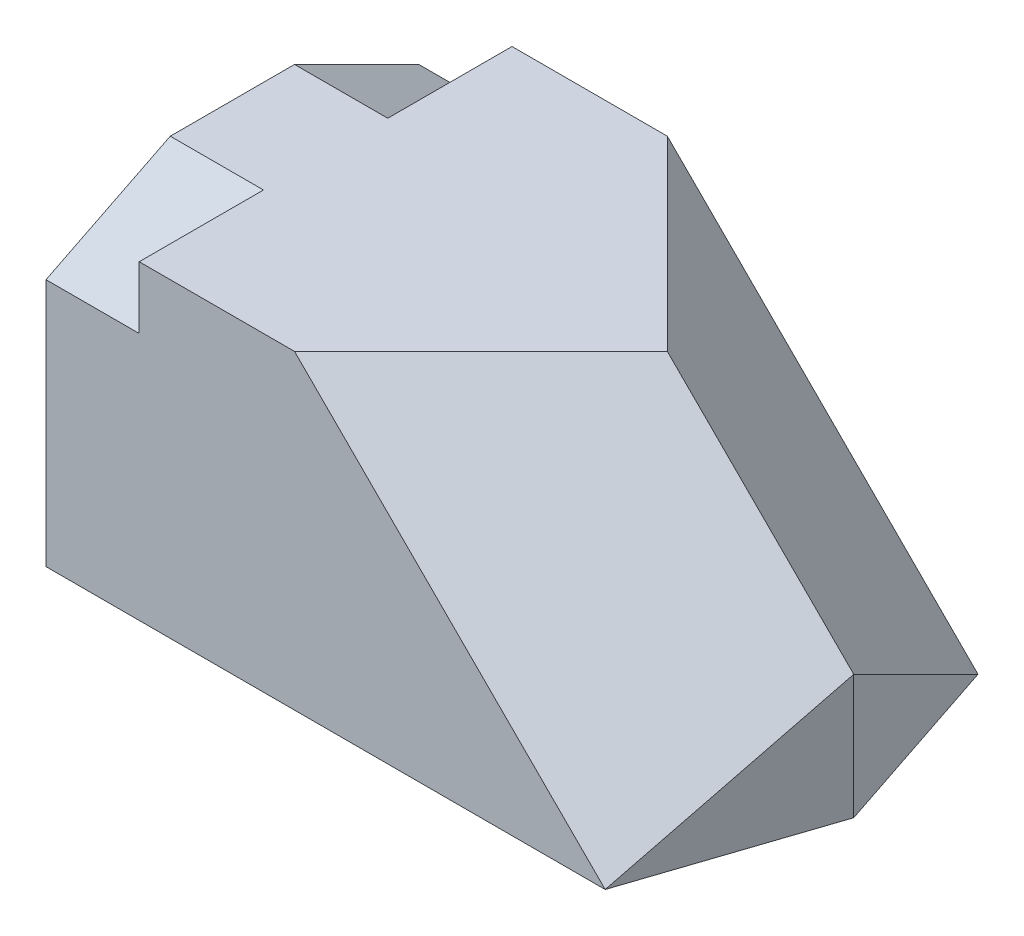
ISO-10303-21;
HEADER;
FILE_DESCRIPTION(('STEP AP214'),'2;1');
FILE_NAME('part.step','',(''),(''),'','','');
FILE_SCHEMA(('AUTOMOTIVE_DESIGN { 1 0 10303 214 1 1 1 1 }'));
ENDSEC;
DATA;
#1=APPLICATION_CONTEXT('core data for automotive mechanical design processes');
#2=APPLICATION_PROTOCOL_DEFINITION('international standard','automotive_design',2000,#1);
#3=PRODUCT_CONTEXT('',#1,'mechanical');
#4=PRODUCT('Part','Part','',(#3));
#5=PRODUCT_RELATED_PRODUCT_CATEGORY('part','',(#4));
#6=PRODUCT_DEFINITION_FORMATION('','',#4);
#7=PRODUCT_DEFINITION_CONTEXT('part definition',#1,'design');
#8=PRODUCT_DEFINITION('design','',#6,#7);
#9=PRODUCT_DEFINITION_SHAPE('','',#8);
#10=(LENGTH_UNIT() NAMED_UNIT(*) SI_UNIT(.MILLI.,.METRE.));
#11=(NAMED_UNIT(*) PLANE_ANGLE_UNIT() SI_UNIT($,.RADIAN.));
#12=(NAMED_UNIT(*) SI_UNIT($,.STERADIAN.) SOLID_ANGLE_UNIT());
#13=UNCERTAINTY_MEASURE_WITH_UNIT(LENGTH_MEASURE(1.E-05),#10,'distance_accuracy_value','');
#14=(GEOMETRIC_REPRESENTATION_CONTEXT(3) GLOBAL_UNCERTAINTY_ASSIGNED_CONTEXT((#13)) GLOBAL_UNIT_ASSIGNED_CONTEXT((#10,
#11,#12)) REPRESENTATION_CONTEXT('',''));
#15=CARTESIAN_POINT('',(0.,0.,0.));
#16=DIRECTION('',(0.,0.,1.));
#17=DIRECTION('',(1.,0.,0.));
#18=AXIS2_PLACEMENT_3D('',#15,#16,#17);
#19=CARTESIAN_POINT('',(0.,0.,-30.));
#20=DIRECTION('',(0.,0.,1.));
#21=DIRECTION('',(1.,0.,0.));
#22=AXIS2_PLACEMENT_3D('',#19,#20,#21);
#23=PLANE('',#22);
#24=DIRECTION('',(-0.707106781186548,0.707106781186548,0.));
#25=VECTOR('',#24,1.);
#26=CARTESIAN_POINT('',(95.,-5.00000000000001,-30.));
#27=LINE('',#26,#25);
#28=CARTESIAN_POINT('',(90.,0.,-30.));
#29=VERTEX_POINT('',#28);
#30=CARTESIAN_POINT('',(40.,50.,-30.));
#31=VERTEX_POINT('',#30);
#32=EDGE_CURVE('E115',#29,#31,#27,.T.);
#33=ORIENTED_EDGE('',*,*,#32,.F.);
#34=DIRECTION('',(1.,0.,0.));
#35=VECTOR('',#34,1.);
#36=CARTESIAN_POINT('',(0.,0.,-30.));
#37=LINE('',#36,#35);
#38=CARTESIAN_POINT('',(0.,0.,-30.));
#39=VERTEX_POINT('',#38);
#40=EDGE_CURVE('E135',#39,#29,#37,.T.);
#41=ORIENTED_EDGE('',*,*,#40,.F.);
#42=DIRECTION('',(0.,-1.,0.));
#43=VECTOR('',#42,1.);
#44=CARTESIAN_POINT('',(0.,50.,-30.));
#45=LINE('',#44,#43);
#46=CARTESIAN_POINT('',(0.,40.,-30.));
#47=VERTEX_POINT('',#46);
#48=EDGE_CURVE('E140',#47,#39,#45,.T.);
#49=ORIENTED_EDGE('',*,*,#48,.F.);
#50=DIRECTION('',(-1.,0.,0.));
#51=VECTOR('',#50,1.);
#52=CARTESIAN_POINT('',(15.,40.,-30.));
#53=LINE('',#52,#51);
#54=CARTESIAN_POINT('',(15.,40.,-30.));
#55=VERTEX_POINT('',#54);
#56=EDGE_CURVE('E185',#55,#47,#53,.T.);
#57=ORIENTED_EDGE('',*,*,#56,.F.);
#58=DIRECTION('',(0.,1.,0.));
#59=VECTOR('',#58,1.);
#60=CARTESIAN_POINT('',(15.,50.,-30.));
#61=LINE('',#60,#59);
#62=CARTESIAN_POINT('',(15.,50.,-30.));
#63=VERTEX_POINT('',#62);
#64=EDGE_CURVE('E133',#55,#63,#61,.T.);
#65=ORIENTED_EDGE('',*,*,#64,.T.);
#66=DIRECTION('',(-1.,0.,0.));
#67=VECTOR('',#66,1.);
#68=CARTESIAN_POINT('',(100.,50.,-30.));
#69=LINE('',#68,#67);
#70=EDGE_CURVE('E54',#31,#63,#69,.T.);
#71=ORIENTED_EDGE('',*,*,#70,.F.);
#72=EDGE_LOOP('',(#33,#41,#49,#57,#65,#71));
#73=FACE_BOUND('',#72,.T.);
#74=ADVANCED_FACE('F39',(#73),#23,.F.);
#75=CARTESIAN_POINT('',(100.,50.,30.));
#76=DIRECTION('',(0.,-1.,0.));
#77=DIRECTION('',(1.,0.,0.));
#78=AXIS2_PLACEMENT_3D('',#75,#76,#77);
#79=PLANE('',#78);
#80=DIRECTION('',(-0.707106781186547,0.,-0.707106781186547));
#81=VECTOR('',#80,1.);
#82=CARTESIAN_POINT('',(70.,50.,0.));
#83=LINE('',#82,#81);
#84=CARTESIAN_POINT('',(70.,50.,0.));
#85=VERTEX_POINT('',#84);
#86=EDGE_CURVE('E117',#85,#31,#83,.T.);
#87=ORIENTED_EDGE('',*,*,#86,.T.);
#88=ORIENTED_EDGE('',*,*,#70,.T.);
#89=DIRECTION('',(0.,0.,1.));
#90=VECTOR('',#89,1.);
#91=CARTESIAN_POINT('',(15.,50.,-10.));
#92=LINE('',#91,#90);
#93=CARTESIAN_POINT('',(15.,50.,-10.));
#94=VERTEX_POINT('',#93);
#95=EDGE_CURVE('E192',#63,#94,#92,.T.);
#96=ORIENTED_EDGE('',*,*,#95,.T.);
#97=DIRECTION('',(-1.,0.,0.));
#98=VECTOR('',#97,1.);
#99=CARTESIAN_POINT('',(15.,50.,-10.));
#100=LINE('',#99,#98);
#101=CARTESIAN_POINT('',(0.,50.,-10.));
#102=VERTEX_POINT('',#101);
#103=EDGE_CURVE('E184',#94,#102,#100,.T.);
#104=ORIENTED_EDGE('',*,*,#103,.T.);
#105=DIRECTION('',(0.,0.,-1.));
#106=VECTOR('',#105,1.);
#107=CARTESIAN_POINT('',(0.,50.,30.));
#108=LINE('',#107,#106);
#109=CARTESIAN_POINT('',(0.,50.,10.));
#110=VERTEX_POINT('',#109);
#111=EDGE_CURVE('E47',#110,#102,#108,.T.);
#112=ORIENTED_EDGE('',*,*,#111,.F.);
#113=DIRECTION('',(-1.,0.,0.));
#114=VECTOR('',#113,1.);
#115=CARTESIAN_POINT('',(15.,50.,10.));
#116=LINE('',#115,#114);
#117=CARTESIAN_POINT('',(15.,50.,10.));
#118=VERTEX_POINT('',#117);
#119=EDGE_CURVE('E159',#118,#110,#116,.T.);
#120=ORIENTED_EDGE('',*,*,#119,.F.);
#121=DIRECTION('',(0.,0.,-1.));
#122=VECTOR('',#121,1.);
#123=CARTESIAN_POINT('',(15.,50.,10.));
#124=LINE('',#123,#122);
#125=CARTESIAN_POINT('',(15.,50.,30.));
#126=VERTEX_POINT('',#125);
#127=EDGE_CURVE('E167',#126,#118,#124,.T.);
#128=ORIENTED_EDGE('',*,*,#127,.F.);
#129=DIRECTION('',(-1.,0.,0.));
#130=VECTOR('',#129,1.);
#131=CARTESIAN_POINT('',(100.,50.,30.));
#132=LINE('',#131,#130);
#133=CARTESIAN_POINT('',(40.,50.,30.));
#134=VERTEX_POINT('',#133);
#135=EDGE_CURVE('E144',#134,#126,#132,.T.);
#136=ORIENTED_EDGE('',*,*,#135,.F.);
#137=DIRECTION('',(-0.707106781186547,0.,0.707106781186547));
#138=VECTOR('',#137,1.);
#139=CARTESIAN_POINT('',(70.,50.,0.));
#140=LINE('',#139,#138);
#141=EDGE_CURVE('E128',#85,#134,#140,.T.);
#142=ORIENTED_EDGE('',*,*,#141,.F.);
#143=EDGE_LOOP('',(#87,#88,#96,#104,#112,#120,#128,#136,#142));
#144=FACE_BOUND('',#143,.T.);
#145=ADVANCED_FACE('F126',(#144),#79,.F.);
#146=CARTESIAN_POINT('',(100.,20.,0.));
#147=DIRECTION('',(0.948683298050514,0.,-0.316227766016838));
#148=DIRECTION('',(-0.316227766016838,0.,-0.948683298050514));
#149=AXIS2_PLACEMENT_3D('',#146,#147,#148);
#150=PLANE('',#149);
#151=DIRECTION('',(0.316227766016838,0.,0.948683298050514));
#152=VECTOR('',#151,1.);
#153=CARTESIAN_POINT('',(100.,0.,0.));
#154=LINE('',#153,#152);
#155=CARTESIAN_POINT('',(100.,0.,0.));
#156=VERTEX_POINT('',#155);
#157=EDGE_CURVE('E193',#29,#156,#154,.T.);
#158=ORIENTED_EDGE('',*,*,#157,.F.);
#159=DIRECTION('',(0.267261241912424,0.534522483824849,0.801783725737273));
#160=VECTOR('',#159,1.);
#161=CARTESIAN_POINT('',(100.,20.,0.));
#162=LINE('',#161,#160);
#163=CARTESIAN_POINT('',(100.,20.,0.));
#164=VERTEX_POINT('',#163);
#165=EDGE_CURVE('E120',#29,#164,#162,.T.);
#166=ORIENTED_EDGE('',*,*,#165,.T.);
#167=DIRECTION('',(0.,-1.,0.));
#168=VECTOR('',#167,1.);
#169=CARTESIAN_POINT('',(100.,20.,0.));
#170=LINE('',#169,#168);
#171=EDGE_CURVE('E168',#164,#156,#170,.T.);
#172=ORIENTED_EDGE('',*,*,#171,.T.);
#173=EDGE_LOOP('',(#158,#166,#172));
#174=FACE_BOUND('',#173,.T.);
#175=ADVANCED_FACE('F201',(#174),#150,.T.);
#176=CARTESIAN_POINT('',(0.,0.,30.));
#177=DIRECTION('',(0.,1.,0.));
#178=DIRECTION('',(0.,0.,1.));
#179=AXIS2_PLACEMENT_3D('',#176,#177,#178);
#180=PLANE('',#179);
#181=ORIENTED_EDGE('',*,*,#157,.T.);
#182=DIRECTION('',(0.316227766016838,0.,-0.948683298050514));
#183=VECTOR('',#182,1.);
#184=CARTESIAN_POINT('',(100.,0.,0.));
#185=LINE('',#184,#183);
#186=CARTESIAN_POINT('',(90.,0.,30.));
#187=VERTEX_POINT('',#186);
#188=EDGE_CURVE('E173',#187,#156,#185,.T.);
#189=ORIENTED_EDGE('',*,*,#188,.F.);
#190=DIRECTION('',(1.,0.,0.));
#191=VECTOR('',#190,1.);
#192=CARTESIAN_POINT('',(0.,0.,30.));
#193=LINE('',#192,#191);
#194=CARTESIAN_POINT('',(0.,0.,30.));
#195=VERTEX_POINT('',#194);
#196=EDGE_CURVE('E137',#195,#187,#193,.T.);
#197=ORIENTED_EDGE('',*,*,#196,.F.);
#198=DIRECTION('',(0.,0.,-1.));
#199=VECTOR('',#198,1.);
#200=CARTESIAN_POINT('',(0.,0.,30.));
#201=LINE('',#200,#199);
#202=EDGE_CURVE('E11',#195,#39,#201,.T.);
#203=ORIENTED_EDGE('',*,*,#202,.T.);
#204=ORIENTED_EDGE('',*,*,#40,.T.);
#205=EDGE_LOOP('',(#181,#189,#197,#203,#204));
#206=FACE_BOUND('',#205,.T.);
#207=ADVANCED_FACE('F210',(#206),#180,.F.);
#208=CARTESIAN_POINT('',(0.,50.,30.));
#209=DIRECTION('',(1.,0.,0.));
#210=DIRECTION('',(0.,1.,0.));
#211=AXIS2_PLACEMENT_3D('',#208,#209,#210);
#212=PLANE('',#211);
#213=DIRECTION('',(0.,-0.447213595499958,-0.894427190999916));
#214=VECTOR('',#213,1.);
#215=CARTESIAN_POINT('',(0.,40.,-30.));
#216=LINE('',#215,#214);
#217=EDGE_CURVE('E190',#102,#47,#216,.T.);
#218=ORIENTED_EDGE('',*,*,#217,.T.);
#219=ORIENTED_EDGE('',*,*,#48,.T.);
#220=ORIENTED_EDGE('',*,*,#202,.F.);
#221=DIRECTION('',(0.,-1.,0.));
#222=VECTOR('',#221,1.);
#223=CARTESIAN_POINT('',(0.,50.,30.));
#224=LINE('',#223,#222);
#225=CARTESIAN_POINT('',(0.,40.,30.));
#226=VERTEX_POINT('',#225);
#227=EDGE_CURVE('E134',#226,#195,#224,.T.);
#228=ORIENTED_EDGE('',*,*,#227,.F.);
#229=DIRECTION('',(0.,-0.447213595499958,0.894427190999916));
#230=VECTOR('',#229,1.);
#231=CARTESIAN_POINT('',(0.,40.,30.));
#232=LINE('',#231,#230);
#233=EDGE_CURVE('E165',#110,#226,#232,.T.);
#234=ORIENTED_EDGE('',*,*,#233,.F.);
#235=ORIENTED_EDGE('',*,*,#111,.T.);
#236=EDGE_LOOP('',(#218,#219,#220,#228,#234,#235));
#237=FACE_BOUND('',#236,.T.);
#238=ADVANCED_FACE('F41',(#237),#212,.F.);
#239=CARTESIAN_POINT('',(0.,0.,30.));
#240=DIRECTION('',(0.,0.,1.));
#241=DIRECTION('',(1.,0.,0.));
#242=AXIS2_PLACEMENT_3D('',#239,#240,#241);
#243=PLANE('',#242);
#244=DIRECTION('',(-0.707106781186548,0.707106781186548,0.));
#245=VECTOR('',#244,1.);
#246=CARTESIAN_POINT('',(95.,-5.00000000000001,30.));
#247=LINE('',#246,#245);
#248=EDGE_CURVE('E179',#187,#134,#247,.T.);
#249=ORIENTED_EDGE('',*,*,#248,.T.);
#250=ORIENTED_EDGE('',*,*,#135,.T.);
#251=DIRECTION('',(0.,1.,0.));
#252=VECTOR('',#251,1.);
#253=CARTESIAN_POINT('',(15.,50.,30.));
#254=LINE('',#253,#252);
#255=CARTESIAN_POINT('',(15.,40.,30.));
#256=VERTEX_POINT('',#255);
#257=EDGE_CURVE('E162',#256,#126,#254,.T.);
#258=ORIENTED_EDGE('',*,*,#257,.F.);
#259=DIRECTION('',(-1.,0.,0.));
#260=VECTOR('',#259,1.);
#261=CARTESIAN_POINT('',(15.,40.,30.));
#262=LINE('',#261,#260);
#263=EDGE_CURVE('E155',#256,#226,#262,.T.);
#264=ORIENTED_EDGE('',*,*,#263,.T.);
#265=ORIENTED_EDGE('',*,*,#227,.T.);
#266=ORIENTED_EDGE('',*,*,#196,.T.);
#267=EDGE_LOOP('',(#249,#250,#258,#264,#265,#266));
#268=FACE_BOUND('',#267,.T.);
#269=ADVANCED_FACE('F211',(#268),#243,.T.);
#270=CARTESIAN_POINT('',(15.,40.,30.));
#271=DIRECTION('',(0.,-0.894427190999916,-0.447213595499958));
#272=DIRECTION('',(0.,0.447213595499958,-0.894427190999916));
#273=AXIS2_PLACEMENT_3D('',#270,#271,#272);
#274=PLANE('',#273);
#275=ORIENTED_EDGE('',*,*,#233,.T.);
#276=ORIENTED_EDGE('',*,*,#263,.F.);
#277=DIRECTION('',(0.,-0.447213595499958,0.894427190999916));
#278=VECTOR('',#277,1.);
#279=CARTESIAN_POINT('',(15.,40.,30.));
#280=LINE('',#279,#278);
#281=EDGE_CURVE('E62',#118,#256,#280,.T.);
#282=ORIENTED_EDGE('',*,*,#281,.F.);
#283=ORIENTED_EDGE('',*,*,#119,.T.);
#284=EDGE_LOOP('',(#275,#276,#282,#283));
#285=FACE_BOUND('',#284,.T.);
#286=ADVANCED_FACE('F220',(#285),#274,.F.);
#287=CARTESIAN_POINT('',(15.,0.,0.));
#288=DIRECTION('',(1.,0.,0.));
#289=DIRECTION('',(0.,1.,0.));
#290=AXIS2_PLACEMENT_3D('',#287,#288,#289);
#291=PLANE('',#290);
#292=ORIENTED_EDGE('',*,*,#127,.T.);
#293=ORIENTED_EDGE('',*,*,#281,.T.);
#294=ORIENTED_EDGE('',*,*,#257,.T.);
#295=EDGE_LOOP('',(#292,#293,#294));
#296=FACE_BOUND('',#295,.T.);
#297=ADVANCED_FACE('F221',(#296),#291,.F.);
#298=CARTESIAN_POINT('',(100.,20.,0.));
#299=DIRECTION('',(-0.948683298050514,0.,-0.316227766016838));
#300=DIRECTION('',(-0.316227766016838,0.,0.948683298050514));
#301=AXIS2_PLACEMENT_3D('',#298,#299,#300);
#302=PLANE('',#301);
#303=ORIENTED_EDGE('',*,*,#171,.F.);
#304=DIRECTION('',(-0.267261241912424,-0.534522483824849,0.801783725737273));
#305=VECTOR('',#304,1.);
#306=CARTESIAN_POINT('',(100.,20.,0.));
#307=LINE('',#306,#305);
#308=EDGE_CURVE('E176',#164,#187,#307,.T.);
#309=ORIENTED_EDGE('',*,*,#308,.T.);
#310=ORIENTED_EDGE('',*,*,#188,.T.);
#311=EDGE_LOOP('',(#303,#309,#310));
#312=FACE_BOUND('',#311,.T.);
#313=ADVANCED_FACE('F207',(#312),#302,.F.);
#314=CARTESIAN_POINT('',(125.,-5.,0.));
#315=DIRECTION('',(-0.577350269189626,-0.577350269189626,-0.577350269189626));
#316=DIRECTION('',(-0.707106781186548,0.,0.707106781186547));
#317=AXIS2_PLACEMENT_3D('',#314,#315,#316);
#318=PLANE('',#317);
#319=DIRECTION('',(-0.707106781186548,0.707106781186548,0.));
#320=VECTOR('',#319,1.);
#321=CARTESIAN_POINT('',(125.,-5.,0.));
#322=LINE('',#321,#320);
#323=EDGE_CURVE('E180',#164,#85,#322,.T.);
#324=ORIENTED_EDGE('',*,*,#323,.T.);
#325=ORIENTED_EDGE('',*,*,#141,.T.);
#326=ORIENTED_EDGE('',*,*,#248,.F.);
#327=ORIENTED_EDGE('',*,*,#308,.F.);
#328=EDGE_LOOP('',(#324,#325,#326,#327));
#329=FACE_BOUND('',#328,.T.);
#330=ADVANCED_FACE('F204',(#329),#318,.F.);
#331=CARTESIAN_POINT('',(15.,40.,-30.));
#332=DIRECTION('',(0.,0.894427190999916,-0.447213595499958));
#333=DIRECTION('',(0.,0.447213595499958,0.894427190999916));
#334=AXIS2_PLACEMENT_3D('',#331,#332,#333);
#335=PLANE('',#334);
#336=ORIENTED_EDGE('',*,*,#217,.F.);
#337=ORIENTED_EDGE('',*,*,#103,.F.);
#338=DIRECTION('',(0.,-0.447213595499958,-0.894427190999916));
#339=VECTOR('',#338,1.);
#340=CARTESIAN_POINT('',(15.,40.,-30.));
#341=LINE('',#340,#339);
#342=EDGE_CURVE('E187',#94,#55,#341,.T.);
#343=ORIENTED_EDGE('',*,*,#342,.T.);
#344=ORIENTED_EDGE('',*,*,#56,.T.);
#345=EDGE_LOOP('',(#336,#337,#343,#344));
#346=FACE_BOUND('',#345,.T.);
#347=ADVANCED_FACE('F213',(#346),#335,.T.);
#348=CARTESIAN_POINT('',(15.,0.,0.));
#349=DIRECTION('',(1.,0.,0.));
#350=DIRECTION('',(0.,1.,0.));
#351=AXIS2_PLACEMENT_3D('',#348,#349,#350);
#352=PLANE('',#351);
#353=ORIENTED_EDGE('',*,*,#95,.F.);
#354=ORIENTED_EDGE('',*,*,#64,.F.);
#355=ORIENTED_EDGE('',*,*,#342,.F.);
#356=EDGE_LOOP('',(#353,#354,#355));
#357=FACE_BOUND('',#356,.T.);
#358=ADVANCED_FACE('F216',(#357),#352,.F.);
#359=CARTESIAN_POINT('',(125.,-5.,0.));
#360=DIRECTION('',(0.577350269189626,0.577350269189626,-0.577350269189626));
#361=DIRECTION('',(-0.707106781186548,0.,-0.707106781186547));
#362=AXIS2_PLACEMENT_3D('',#359,#360,#361);
#363=PLANE('',#362);
#364=ORIENTED_EDGE('',*,*,#32,.T.);
#365=ORIENTED_EDGE('',*,*,#86,.F.);
#366=ORIENTED_EDGE('',*,*,#323,.F.);
#367=ORIENTED_EDGE('',*,*,#165,.F.);
#368=EDGE_LOOP('',(#364,#365,#366,#367));
#369=FACE_BOUND('',#368,.T.);
#370=ADVANCED_FACE('F116',(#369),#363,.T.);
#371=CLOSED_SHELL('',(#74,#145,#175,#207,#238,#269,#286,#297,#313,#330,#347,#358,#370));
#372=MANIFOLD_SOLID_BREP('B2',#371);
#373=ADVANCED_BREP_SHAPE_REPRESENTATION('',(#18,#372),#14);
#374=SHAPE_DEFINITION_REPRESENTATION(#9,#373);
ENDSEC;
END-ISO-10303-21;
